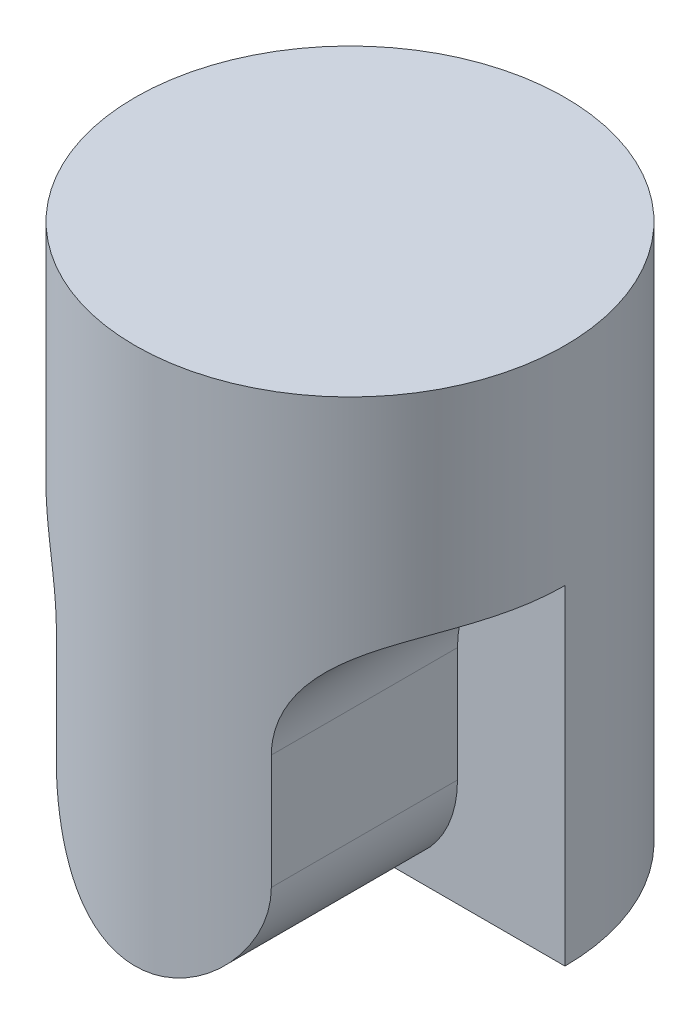
ISO-10303-21;
HEADER;
FILE_DESCRIPTION(('STEP AP214'),'2;1');
FILE_NAME('part.step','',(''),(''),'','','');
FILE_SCHEMA(('AUTOMOTIVE_DESIGN { 1 0 10303 214 1 1 1 1 }'));
ENDSEC;
DATA;
#1=APPLICATION_CONTEXT('core data for automotive mechanical design processes');
#2=APPLICATION_PROTOCOL_DEFINITION('international standard','automotive_design',2000,#1);
#3=PRODUCT_CONTEXT('',#1,'mechanical');
#4=PRODUCT('Part','Part','',(#3));
#5=PRODUCT_RELATED_PRODUCT_CATEGORY('part','',(#4));
#6=PRODUCT_DEFINITION_FORMATION('','',#4);
#7=PRODUCT_DEFINITION_CONTEXT('part definition',#1,'design');
#8=PRODUCT_DEFINITION('design','',#6,#7);
#9=PRODUCT_DEFINITION_SHAPE('','',#8);
#10=(LENGTH_UNIT() NAMED_UNIT(*) SI_UNIT(.MILLI.,.METRE.));
#11=(NAMED_UNIT(*) PLANE_ANGLE_UNIT() SI_UNIT($,.RADIAN.));
#12=(NAMED_UNIT(*) SI_UNIT($,.STERADIAN.) SOLID_ANGLE_UNIT());
#13=UNCERTAINTY_MEASURE_WITH_UNIT(LENGTH_MEASURE(1.E-05),#10,'distance_accuracy_value','');
#14=(GEOMETRIC_REPRESENTATION_CONTEXT(3) GLOBAL_UNCERTAINTY_ASSIGNED_CONTEXT((#13)) GLOBAL_UNIT_ASSIGNED_CONTEXT((#10,
#11,#12)) REPRESENTATION_CONTEXT('',''));
#15=CARTESIAN_POINT('',(0.,0.,0.));
#16=DIRECTION('',(0.,0.,1.));
#17=DIRECTION('',(1.,0.,0.));
#18=AXIS2_PLACEMENT_3D('',#15,#16,#17);
#19=CARTESIAN_POINT('',(0.,47.625,0.));
#20=DIRECTION('',(0.,-1.,0.));
#21=DIRECTION('',(0.,0.,-1.));
#22=AXIS2_PLACEMENT_3D('',#19,#20,#21);
#23=CYLINDRICAL_SURFACE('',#22,19.05);
#24=CARTESIAN_POINT('',(0.,47.625,0.));
#25=DIRECTION('',(0.,1.,0.));
#26=DIRECTION('',(0.,0.,1.));
#27=AXIS2_PLACEMENT_3D('',#24,#25,#26);
#28=CIRCLE('',#27,19.05);
#29=CARTESIAN_POINT('',(0.,47.625,19.05));
#30=VERTEX_POINT('',#29);
#31=EDGE_CURVE('E153',#30,#30,#28,.T.);
#32=ORIENTED_EDGE('',*,*,#31,.F.);
#33=EDGE_LOOP('',(#32));
#34=FACE_BOUND('',#33,.T.);
#35=DIRECTION('',(0.,-1.,0.));
#36=VECTOR('',#35,1.);
#37=CARTESIAN_POINT('',(-19.05,29.21,0.));
#38=LINE('',#37,#36);
#39=CARTESIAN_POINT('',(-19.05,29.21,0.));
#40=VERTEX_POINT('',#39);
#41=CARTESIAN_POINT('',(-19.05,0.,0.));
#42=VERTEX_POINT('',#41);
#43=EDGE_CURVE('E107',#40,#42,#38,.T.);
#44=ORIENTED_EDGE('',*,*,#43,.F.);
#45=CARTESIAN_POINT('',(-9.525,19.685,16.4977839420936));
#46=CARTESIAN_POINT('',(-9.52496088221768,19.9183489225181,16.4977688060201));
#47=CARTESIAN_POINT('',(-9.53357343537535,20.1516940752239,16.4928328837783));
#48=CARTESIAN_POINT('',(-9.56782098455367,20.6166928659615,16.4730090010301));
#49=CARTESIAN_POINT('',(-9.59345495367734,20.8483466051835,16.4581216408907));
#50=CARTESIAN_POINT('',(-9.66141827916372,21.3079945595453,16.4183115148276));
#51=CARTESIAN_POINT('',(-9.70372489570546,21.5359933207643,16.3934024165871));
#52=CARTESIAN_POINT('',(-9.80447603838081,21.9870185373,16.3333465257956));
#53=CARTESIAN_POINT('',(-9.86292032641455,22.2100450659259,16.2981998842917));
#54=CARTESIAN_POINT('',(-9.99521610639255,22.6496647273588,16.2174027920262));
#55=CARTESIAN_POINT('',(-10.0690759660033,22.8662542928987,16.1717466352449));
#56=CARTESIAN_POINT('',(-10.2311844392112,23.2913646090355,16.0696774570777));
#57=CARTESIAN_POINT('',(-10.3194332274116,23.4998852616819,16.0132643051592));
#58=CARTESIAN_POINT('',(-10.5090614848233,23.907378271473,15.889459842336));
#59=CARTESIAN_POINT('',(-10.610436090431,24.1063541280786,15.8220725953698));
#60=CARTESIAN_POINT('',(-10.8249112557721,24.4935890964673,15.6761159898764));
#61=CARTESIAN_POINT('',(-10.9380117932454,24.6818482285936,15.5975466525768));
#62=CARTESIAN_POINT('',(-11.1750045786399,25.0476332269237,15.428644017613));
#63=CARTESIAN_POINT('',(-11.2989547084654,25.225091737611,15.3382461680053));
#64=CARTESIAN_POINT('',(-11.5553100388477,25.5672572592252,15.146054428585));
#65=CARTESIAN_POINT('',(-11.6877152197723,25.7319642997583,15.0442605652328));
#66=CARTESIAN_POINT('',(-11.959148929316,26.0480866299765,14.8294036879515));
#67=CARTESIAN_POINT('',(-12.0981788316448,26.1994991442271,14.7163383313975));
#68=CARTESIAN_POINT('',(-12.3809673411905,26.4887154893166,14.4792332961164));
#69=CARTESIAN_POINT('',(-12.5247264570661,26.6265178498703,14.3551924344594));
#70=CARTESIAN_POINT('',(-12.8240837443095,26.8965667697806,14.08857600897));
#71=CARTESIAN_POINT('',(-12.9798652873072,27.0279466150489,13.9453291609657));
#72=CARTESIAN_POINT('',(-13.292596777246,27.2756345492098,13.6475637114415));
#73=CARTESIAN_POINT('',(-13.4495467455553,27.3919423617454,13.4930449033231));
#74=CARTESIAN_POINT('',(-13.762754527445,27.6100925803929,13.1734257935092));
#75=CARTESIAN_POINT('',(-13.9190122351257,27.7119328426242,13.0083239288083));
#76=CARTESIAN_POINT('',(-14.2291689687109,27.9019522424798,12.6683171080798));
#77=CARTESIAN_POINT('',(-14.3830675205959,27.9901286662581,12.4934102139944));
#78=CARTESIAN_POINT('',(-14.7634019767403,28.1948738825906,12.0444610740112));
#79=CARTESIAN_POINT('',(-14.9874622880082,28.3034702163249,11.7647359891822));
#80=CARTESIAN_POINT('',(-15.4231140025516,28.4956795942884,11.1875373147456));
#81=CARTESIAN_POINT('',(-15.6347002190687,28.5792823041117,10.8900564442661));
#82=CARTESIAN_POINT('',(-16.0430181059987,28.7255106526052,10.2790758596334));
#83=CARTESIAN_POINT('',(-16.2397117705415,28.7880839352012,9.96553837162547));
#84=CARTESIAN_POINT('',(-16.6156059306471,28.8957307298342,9.32534286156705));
#85=CARTESIAN_POINT('',(-16.7948065222032,28.9408043379049,8.99868491152914));
#86=CARTESIAN_POINT('',(-17.1919107043764,29.0299199555339,8.2213326110348));
#87=CARTESIAN_POINT('',(-17.4023168073958,29.068423234301,7.76615790744586));
#88=CARTESIAN_POINT('',(-17.7869232765458,29.1278875229511,6.83957324511065));
#89=CARTESIAN_POINT('',(-17.9611090507862,29.1488414730828,6.36815683196184));
#90=CARTESIAN_POINT('',(-18.2716936861273,29.1794304518547,5.41292995545997));
#91=CARTESIAN_POINT('',(-18.4081089023756,29.1890703854879,4.92912495598502));
#92=CARTESIAN_POINT('',(-18.6422412025836,29.201989918901,3.95240402807187));
#93=CARTESIAN_POINT('',(-18.7399742848313,29.2052721503127,3.45949195463885));
#94=CARTESIAN_POINT('',(-18.8953354589647,29.2090593684037,2.47291842915605));
#95=CARTESIAN_POINT('',(-18.9533953562265,29.209594684118,1.97932562121706));
#96=CARTESIAN_POINT('',(-19.0113808096327,29.2099382589662,1.23744501792454));
#97=CARTESIAN_POINT('',(-19.0258585637053,29.2099764580419,0.99021633027258));
#98=CARTESIAN_POINT('',(-19.0451690165321,29.2100015099948,0.495333730012836));
#99=CARTESIAN_POINT('',(-19.0499998133406,29.2099883527484,0.247679743186018));
#100=CARTESIAN_POINT('',(-19.05,29.21,0.));
#101=B_SPLINE_CURVE_WITH_KNOTS('',3,(#45,#46,#47,#48,#49,#50,#51,#52,#53,#54,#55,#56,#57,#58,
#59,#60,#61,#62,#63,#64,#65,#66,#67,#68,#69,#70,#71,#72,#73,#74,#75,#76,#77,#78,#79,#80,#81,#82,
#83,#84,#85,#86,#87,#88,#89,#90,#91,#92,#93,#94,#95,#96,#97,#98,#99,#100),.UNSPECIFIED.,.F.,.F.,
(4,2,2,2,2,2,2,2,2,2,2,2,2,2,2,2,2,2,2,2,2,2,2,2,2,2,2,4),(0.,0.699830412948111,
1.39961860917055,2.09845564936072,2.79728237925847,3.49648942772335,4.19570496138007,
4.89466214716575,5.59361800609943,6.29656113471492,6.99950263119766,7.70259053020982,
8.40575429989958,9.15228216119596,9.89882370870057,10.6454757676643,11.39227593352,
12.514027104908,13.6362414603873,14.7612293986247,15.886211163132,17.3928861920892,
18.90016703619,20.4067941835203,21.9127975621273,23.4021366350037,24.1449308829149,
24.8878715619513),.UNSPECIFIED.);
#102=CARTESIAN_POINT('',(-9.525,19.685,16.4977839420936));
#103=VERTEX_POINT('',#102);
#104=EDGE_CURVE('E11',#103,#40,#101,.T.);
#105=ORIENTED_EDGE('',*,*,#104,.F.);
#106=DIRECTION('',(0.,-1.,0.));
#107=VECTOR('',#106,1.);
#108=CARTESIAN_POINT('',(-9.525,47.625,16.4977839420936));
#109=LINE('',#108,#107);
#110=CARTESIAN_POINT('',(-9.525,9.525,16.4977839420936));
#111=VERTEX_POINT('',#110);
#112=EDGE_CURVE('E55',#111,#103,#109,.F.);
#113=ORIENTED_EDGE('',*,*,#112,.F.);
#114=CARTESIAN_POINT('',(9.525,9.525,16.4977839420936));
#115=CARTESIAN_POINT('',(9.52500093747722,9.40027257903626,16.4977810736085));
#116=CARTESIAN_POINT('',(9.5225495569074,9.27556275445861,16.4991989884944));
#117=CARTESIAN_POINT('',(9.51275833118321,9.02640408747146,16.5048470302731));
#118=CARTESIAN_POINT('',(9.50541869237711,8.90195523426799,16.5090770384588));
#119=CARTESIAN_POINT('',(9.47610793531884,8.52953393768727,16.5259318086842));
#120=CARTESIAN_POINT('',(9.4468449164186,8.28227418457605,16.5427214150306));
#121=CARTESIAN_POINT('',(9.36949132327823,7.79316834325038,16.5866536291743));
#122=CARTESIAN_POINT('',(9.32150961975951,7.55129934921615,16.6137363475916));
#123=CARTESIAN_POINT('',(9.20730560474538,7.07314911694342,16.6772985791049));
#124=CARTESIAN_POINT('',(9.14108119806888,6.83686852392151,16.7137791715191));
#125=CARTESIAN_POINT('',(8.99129510137312,6.37194751349169,16.7948306150653));
#126=CARTESIAN_POINT('',(8.90777526138408,6.14329017257846,16.8393819054122));
#127=CARTESIAN_POINT('',(8.72407711239021,5.69420111637847,16.9352799266333));
#128=CARTESIAN_POINT('',(8.62389244763594,5.47377257887555,16.9866292486582));
#129=CARTESIAN_POINT('',(8.29930376043627,4.82601405994061,17.1488381079658));
#130=CARTESIAN_POINT('',(8.05095104961338,4.41247529285722,17.2678097679841));
#131=CARTESIAN_POINT('',(7.47383610341883,3.59736922215471,17.5257462600222));
#132=CARTESIAN_POINT('',(7.14015861881285,3.19954734615327,17.6655504594134));
#133=CARTESIAN_POINT('',(6.5945742728477,2.64718480947574,17.8732248981855));
#134=CARTESIAN_POINT('',(6.405096610182,2.47038257450737,17.9421446448262));
#135=CARTESIAN_POINT('',(6.01181385771871,2.13237428291152,18.0777156327596));
#136=CARTESIAN_POINT('',(5.80800671051076,1.97117047381546,18.1443665462486));
#137=CARTESIAN_POINT('',(5.3727806496745,1.65505544151366,18.2781569518622));
#138=CARTESIAN_POINT('',(5.14042653030351,1.50131409278981,18.3450225150718));
#139=CARTESIAN_POINT('',(4.66194023067173,1.21417930587034,18.4724136519109));
#140=CARTESIAN_POINT('',(4.41581396469453,1.08077722351316,18.5329419154386));
#141=CARTESIAN_POINT('',(3.9113048509577,0.835583575964409,18.6459377391247));
#142=CARTESIAN_POINT('',(3.6529249193958,0.723786900816968,18.6984072046882));
#143=CARTESIAN_POINT('',(3.12571930630889,0.523053759715566,18.7937250695438));
#144=CARTESIAN_POINT('',(2.85689473869258,0.434114863667026,18.8365744915169));
#145=CARTESIAN_POINT('',(2.33040396449441,0.285723159455201,18.9086545346245));
#146=CARTESIAN_POINT('',(2.07330466066536,0.224622688619558,18.9386372001567));
#147=CARTESIAN_POINT('',(1.55394863629037,0.123892516824218,18.9883061715623));
#148=CARTESIAN_POINT('',(1.29169214034862,0.0842618829545443,19.0079929248136));
#149=CARTESIAN_POINT('',(0.764329359451927,0.0270138829097091,19.0364912437072));
#150=CARTESIAN_POINT('',(0.499224545496166,0.00938565748228554,19.0453081741061));
#151=CARTESIAN_POINT('',(-0.0316607049127102,-0.00364684179856453,19.0518227422365));
#152=CARTESIAN_POINT('',(-0.297441099043231,0.000947524886808438,19.0495210601461));
#153=CARTESIAN_POINT('',(-0.804260335281708,0.0309220556256001,19.0345541010599));
#154=CARTESIAN_POINT('',(-1.04543822592467,0.0544573009577164,19.0228087656957));
#155=CARTESIAN_POINT('',(-1.52469707257245,0.119714119923031,18.9904047862853));
#156=CARTESIAN_POINT('',(-1.76277824541268,0.161434413083271,18.9697467698133));
#157=CARTESIAN_POINT('',(-2.23423979863317,0.262606638129744,18.9200123581017));
#158=CARTESIAN_POINT('',(-2.46762011548931,0.322058809460912,18.8909358491819));
#159=CARTESIAN_POINT('',(-2.92820911012177,0.458088236319907,18.8250425547938));
#160=CARTESIAN_POINT('',(-3.15541756627715,0.534666105892989,18.7882254917892));
#161=CARTESIAN_POINT('',(-3.60539303848101,0.705394247452505,18.7071268740808));
#162=CARTESIAN_POINT('',(-3.82805781744348,0.799769061635013,18.662750728237));
#163=CARTESIAN_POINT('',(-4.26455258918911,1.00458926157806,18.5678772125521));
#164=CARTESIAN_POINT('',(-4.47837941582088,1.11504034359609,18.51737767409));
#165=CARTESIAN_POINT('',(-5.10493628361556,1.46924131553242,18.3583058720945));
#166=CARTESIAN_POINT('',(-5.50300713782787,1.73594015859678,18.2421108149243));
#167=CARTESIAN_POINT('',(-6.28824042603162,2.35173975094806,17.9874060959009));
#168=CARTESIAN_POINT('',(-6.67082158147181,2.70624414302929,17.8478253733575));
#169=CARTESIAN_POINT('',(-7.19758780100251,3.28095380587619,17.638966791211));
#170=CARTESIAN_POINT('',(-7.36544169669242,3.47985996295611,17.5693768805105));
#171=CARTESIAN_POINT('',(-7.68466910542571,3.89124176578629,17.4321111568734));
#172=CARTESIAN_POINT('',(-7.83604008320189,4.10371949105207,17.3644356395749));
#173=CARTESIAN_POINT('',(-8.13051871428544,4.55533319567051,17.2286143275175));
#174=CARTESIAN_POINT('',(-8.27246277842836,4.79530464840391,17.1607200036441));
#175=CARTESIAN_POINT('',(-8.53533313227252,5.28806294812108,17.0315012846856));
#176=CARTESIAN_POINT('',(-8.65626905076502,5.5408438550808,16.9701738847126));
#177=CARTESIAN_POINT('',(-8.87577538406711,6.05731622619944,16.856404687993));
#178=CARTESIAN_POINT('',(-8.97438588394681,6.32098711427254,16.8039470093352));
#179=CARTESIAN_POINT('',(-9.14827185774226,6.85774586401365,16.7099199172215));
#180=CARTESIAN_POINT('',(-9.22355744265247,7.13082958815204,16.6683457871286));
#181=CARTESIAN_POINT('',(-9.32597272818071,7.57995506914826,16.6111629660557));
#182=CARTESIAN_POINT('',(-9.36056268375989,7.75384156287729,16.5916705965462));
#183=CARTESIAN_POINT('',(-9.42003837397582,8.10374181043107,16.5579753127668));
#184=CARTESIAN_POINT('',(-9.44492679661978,8.27975496106751,16.5437709334007));
#185=CARTESIAN_POINT('',(-9.48486650450729,8.63355937576173,16.5209069824712));
#186=CARTESIAN_POINT('',(-9.49990078649616,8.81135317860914,16.5122569954949));
#187=CARTESIAN_POINT('',(-9.51997579030462,9.16776164551646,16.5006843298703));
#188=CARTESIAN_POINT('',(-9.52501242619609,9.34637661530021,16.4977639928726));
#189=CARTESIAN_POINT('',(-9.525,9.525,16.4977839420936));
#190=B_SPLINE_CURVE_WITH_KNOTS('',3,(#114,#115,#116,#117,#118,#119,#120,#121,#122,#123,#124,
#125,#126,#127,#128,#129,#130,#131,#132,#133,#134,#135,#136,#137,#138,#139,#140,#141,#142,#143,
#144,#145,#146,#147,#148,#149,#150,#151,#152,#153,#154,#155,#156,#157,#158,#159,#160,#161,#162,
#163,#164,#165,#166,#167,#168,#169,#170,#171,#172,#173,#174,#175,#176,#177,#178,#179,#180,#181,
#182,#183,#184,#185,#186,#187,#188,#189),.UNSPECIFIED.,.F.,.F.,(4,2,2,2,2,2,2,2,2,2,2,2,2,2,2,2,
2,2,2,2,2,2,2,2,2,2,2,2,2,2,2,2,2,2,2,2,2,4),(0.,0.374115362522842,0.748214933496801,
1.49577871567587,2.23905786353579,2.98242241289278,3.72400882015595,4.4658787101371,
5.95045512426883,7.55645263772861,8.36024673287263,9.16415647242587,10.0226343458625,
10.8807463441536,11.7386551389014,12.5964726884451,13.3932583086516,14.1900093040547,
14.9863669086265,15.7826757968484,16.5096401614227,17.2365533461549,17.9634763473071,
18.6904254166054,19.4272479176198,20.1643321332658,21.6376476059229,23.250115445615,
24.0576502518051,24.8653090914465,25.725087021335,26.5844698382329,27.4422971837309,
28.2997521522028,28.8345228002716,29.3691451737481,29.9046876229378,30.4404488974167),.UNSPECIFIED.);
#191=CARTESIAN_POINT('',(9.525,9.525,16.4977839420936));
#192=VERTEX_POINT('',#191);
#193=EDGE_CURVE('E155',#192,#111,#190,.T.);
#194=ORIENTED_EDGE('',*,*,#193,.F.);
#195=DIRECTION('',(0.,-1.,0.));
#196=VECTOR('',#195,1.);
#197=CARTESIAN_POINT('',(9.525,47.625,16.4977839420936));
#198=LINE('',#197,#196);
#199=CARTESIAN_POINT('',(9.525,19.685,16.4977839420936));
#200=VERTEX_POINT('',#199);
#201=EDGE_CURVE('E116',#200,#192,#198,.T.);
#202=ORIENTED_EDGE('',*,*,#201,.F.);
#203=CARTESIAN_POINT('',(19.05,29.21,0.));
#204=CARTESIAN_POINT('',(19.0500031423625,29.2099793158079,0.266319267713955));
#205=CARTESIAN_POINT('',(19.0444152804942,29.2099994611175,0.532636111404348));
#206=CARTESIAN_POINT('',(19.0220816882376,29.2099710782212,1.06480200302641));
#207=CARTESIAN_POINT('',(19.0053359391149,29.2099225499002,1.33065105017189));
#208=CARTESIAN_POINT('',(18.9607027480369,29.2096064298755,1.86151223113813));
#209=CARTESIAN_POINT('',(18.9328113312285,29.2093387599842,2.12652403235371));
#210=CARTESIAN_POINT('',(18.8659429637877,29.208279228249,2.65512565628479));
#211=CARTESIAN_POINT('',(18.826966044504,29.2074873678874,2.91871548301934));
#212=CARTESIAN_POINT('',(18.6929770588812,29.2037377959692,3.70973281370498));
#213=CARTESIAN_POINT('',(18.581158321484,29.1993996438799,4.23441175651461));
#214=CARTESIAN_POINT('',(18.3137533312449,29.1824456662411,5.27219090432969));
#215=CARTESIAN_POINT('',(18.1581791971509,29.169832131402,5.7852942729276));
#216=CARTESIAN_POINT('',(17.8379125076404,29.133662897117,6.70075992239466));
#217=CARTESIAN_POINT('',(17.6804671833627,29.1126181010311,7.10576455913998));
#218=CARTESIAN_POINT('',(17.3386312566981,29.0565985204871,7.90332416880696));
#219=CARTESIAN_POINT('',(17.1542402845231,29.0216235448469,8.29587897078353));
#220=CARTESIAN_POINT('',(16.7606596540479,28.9329786268124,9.06469601693218));
#221=CARTESIAN_POINT('',(16.5515475338079,28.8793661656446,9.4410044017695));
#222=CARTESIAN_POINT('',(16.1103899111492,28.7479604657312,10.1755152311398));
#223=CARTESIAN_POINT('',(15.878352893697,28.6701761507772,10.5337243009512));
#224=CARTESIAN_POINT('',(15.4635323640473,28.5109391646804,11.1298527951504));
#225=CARTESIAN_POINT('',(15.2854809081633,28.436804903698,11.3730378563674));
#226=CARTESIAN_POINT('',(14.9211876864376,28.2709521411411,11.8469357107622));
#227=CARTESIAN_POINT('',(14.7349480087414,28.1792381029144,12.0776516507182));
#228=CARTESIAN_POINT('',(14.3566570232797,27.9762115529755,12.5249603388487));
#229=CARTESIAN_POINT('',(14.1646108176963,27.8649158556334,12.7415649871816));
#230=CARTESIAN_POINT('',(13.7773658557318,27.6208237218171,13.1593218625055));
#231=CARTESIAN_POINT('',(13.5821676242865,27.4880308328915,13.3604766310327));
#232=CARTESIAN_POINT('',(13.2244587634061,27.2235414238597,13.7138070687217));
#233=CARTESIAN_POINT('',(13.0619119884757,27.0953370083323,13.8685640756173));
#234=CARTESIAN_POINT('',(12.7392042765104,26.8225136538933,14.1655651153781));
#235=CARTESIAN_POINT('',(12.5790428754823,26.6778979556844,14.3078116088559));
#236=CARTESIAN_POINT('',(12.2635021647983,26.3721016054898,14.5791743176606));
#237=CARTESIAN_POINT('',(12.1081222370277,26.2109231064135,14.7082922351707));
#238=CARTESIAN_POINT('',(11.8046225240808,25.872231057236,14.9529727074532));
#239=CARTESIAN_POINT('',(11.6565028356029,25.6947172896579,15.0685350817093));
#240=CARTESIAN_POINT('',(11.3693895159656,25.3231915201881,15.2863373805226));
#241=CARTESIAN_POINT('',(11.230439737627,25.1291091757352,15.3885153076288));
#242=CARTESIAN_POINT('',(10.964826940015,24.7262118944501,15.5788891221235));
#243=CARTESIAN_POINT('',(10.8381642817918,24.5173965250073,15.6670845986934));
#244=CARTESIAN_POINT('',(10.5993058379913,24.0863783263824,15.8296592787907));
#245=CARTESIAN_POINT('',(10.487117084096,23.8641690665461,15.9040317745394));
#246=CARTESIAN_POINT('',(10.2792478139679,23.4082099521896,16.0391692067522));
#247=CARTESIAN_POINT('',(10.1835654697823,23.174461379248,16.0999356502));
#248=CARTESIAN_POINT('',(10.0175858531755,22.7173607084186,16.2036796029616));
#249=CARTESIAN_POINT('',(9.94583426399626,22.4947757106972,16.24772025966));
#250=CARTESIAN_POINT('',(9.81855225442402,22.0431811636815,16.3249527281687));
#251=CARTESIAN_POINT('',(9.76302096730887,21.814171958378,16.3581451196608));
#252=CARTESIAN_POINT('',(9.66902743600899,21.3518895972506,16.4138779313956));
#253=CARTESIAN_POINT('',(9.63053204886234,21.1186256482057,16.4364390401545));
#254=CARTESIAN_POINT('',(9.57098044062086,20.649221275654,16.4711880105793));
#255=CARTESIAN_POINT('',(9.54991350563648,20.4130827100169,16.4833822452591));
#256=CARTESIAN_POINT('',(9.53345537960647,20.0945553962913,16.4928996548008));
#257=CARTESIAN_POINT('',(9.53028313867884,20.0126327665687,16.4947327063678));
#258=CARTESIAN_POINT('',(9.52605691472012,19.8488098651631,16.4971739342479));
#259=CARTESIAN_POINT('',(9.52500047597256,19.766909678003,16.4977835305723));
#260=CARTESIAN_POINT('',(9.525,19.685,16.4977839420936));
#261=B_SPLINE_CURVE_WITH_KNOTS('',3,(#203,#204,#205,#206,#207,#208,#209,#210,#211,#212,#213,
#214,#215,#216,#217,#218,#219,#220,#221,#222,#223,#224,#225,#226,#227,#228,#229,#230,#231,#232,
#233,#234,#235,#236,#237,#238,#239,#240,#241,#242,#243,#244,#245,#246,#247,#248,#249,#250,#251,
#252,#253,#254,#255,#256,#257,#258,#259,#260),.UNSPECIFIED.,.F.,.F.,(4,2,2,2,2,2,2,2,2,2,2,2,2,
2,2,2,2,2,2,2,2,2,2,2,2,2,2,2,4),(0.,0.798894479078058,1.5977902995246,2.39697128291902,
3.19615000633318,4.80349956064718,6.41040437178401,7.71439554079129,9.01840460678187,
10.3184270506312,11.6179701198004,12.5483662331231,13.4785264393491,14.4078917997747,
15.3371039488346,16.1117460161097,16.8862353816937,17.6606242026084,18.4350233347229,
19.2128914240023,19.9907823635955,20.7690498047639,21.5472310036427,22.2602861531013,
22.9733031939092,23.6849269115434,24.3961128430135,24.6420994894573,24.8878004644176),.UNSPECIFIED.);
#262=CARTESIAN_POINT('',(19.05,29.21,0.));
#263=VERTEX_POINT('',#262);
#264=EDGE_CURVE('E70',#263,#200,#261,.T.);
#265=ORIENTED_EDGE('',*,*,#264,.F.);
#266=DIRECTION('',(0.,1.,0.));
#267=VECTOR('',#266,1.);
#268=CARTESIAN_POINT('',(19.05,-1.366,0.));
#269=LINE('',#268,#267);
#270=CARTESIAN_POINT('',(19.05,0.,0.));
#271=VERTEX_POINT('',#270);
#272=EDGE_CURVE('E99',#271,#263,#269,.T.);
#273=ORIENTED_EDGE('',*,*,#272,.F.);
#274=CARTESIAN_POINT('',(0.,0.,0.));
#275=DIRECTION('',(0.,1.,0.));
#276=DIRECTION('',(0.,0.,1.));
#277=AXIS2_PLACEMENT_3D('',#274,#275,#276);
#278=CIRCLE('',#277,19.05);
#279=EDGE_CURVE('E150',#271,#42,#278,.T.);
#280=ORIENTED_EDGE('',*,*,#279,.T.);
#281=EDGE_LOOP('',(#44,#105,#113,#194,#202,#265,#273,#280));
#282=FACE_BOUND('',#281,.T.);
#283=ADVANCED_FACE('F39',(#34,#282),#23,.T.);
#284=CARTESIAN_POINT('',(0.,0.,0.));
#285=DIRECTION('',(0.,1.,0.));
#286=DIRECTION('',(0.,0.,1.));
#287=AXIS2_PLACEMENT_3D('',#284,#285,#286);
#288=PLANE('',#287);
#289=DIRECTION('',(1.,0.,0.));
#290=VECTOR('',#289,1.);
#291=CARTESIAN_POINT('',(0.,0.,0.));
#292=LINE('',#291,#290);
#293=CARTESIAN_POINT('',(0.,0.,0.));
#294=VERTEX_POINT('',#293);
#295=EDGE_CURVE('E117',#42,#294,#292,.T.);
#296=ORIENTED_EDGE('',*,*,#295,.F.);
#297=ORIENTED_EDGE('',*,*,#279,.F.);
#298=EDGE_CURVE('E103',#294,#271,#292,.T.);
#299=ORIENTED_EDGE('',*,*,#298,.F.);
#300=EDGE_LOOP('',(#296,#297,#299));
#301=FACE_BOUND('',#300,.T.);
#302=ADVANCED_FACE('F138',(#301),#288,.F.);
#303=CARTESIAN_POINT('',(0.,47.625,0.));
#304=DIRECTION('',(0.,1.,0.));
#305=DIRECTION('',(0.,0.,1.));
#306=AXIS2_PLACEMENT_3D('',#303,#304,#305);
#307=PLANE('',#306);
#308=ORIENTED_EDGE('',*,*,#31,.T.);
#309=EDGE_LOOP('',(#308));
#310=FACE_BOUND('',#309,.T.);
#311=ADVANCED_FACE('F134',(#310),#307,.T.);
#312=CARTESIAN_POINT('',(19.05,19.685,19.05));
#313=DIRECTION('',(0.,0.,-1.));
#314=DIRECTION('',(-1.,0.,0.));
#315=AXIS2_PLACEMENT_3D('',#312,#313,#314);
#316=CYLINDRICAL_SURFACE('',#315,9.525);
#317=ORIENTED_EDGE('',*,*,#264,.T.);
#318=DIRECTION('',(0.,0.,-1.));
#319=VECTOR('',#318,1.);
#320=CARTESIAN_POINT('',(9.525,19.685,19.05));
#321=LINE('',#320,#319);
#322=CARTESIAN_POINT('',(9.525,19.685,0.));
#323=VERTEX_POINT('',#322);
#324=EDGE_CURVE('E115',#200,#323,#321,.T.);
#325=ORIENTED_EDGE('',*,*,#324,.T.);
#326=CARTESIAN_POINT('',(19.05,19.685,0.));
#327=DIRECTION('',(0.,0.,1.));
#328=DIRECTION('',(1.,0.,0.));
#329=AXIS2_PLACEMENT_3D('',#326,#327,#328);
#330=CIRCLE('',#329,9.525);
#331=EDGE_CURVE('E105',#263,#323,#330,.T.);
#332=ORIENTED_EDGE('',*,*,#331,.F.);
#333=EDGE_LOOP('',(#317,#325,#332));
#334=FACE_BOUND('',#333,.T.);
#335=ADVANCED_FACE('F112',(#334),#316,.F.);
#336=CARTESIAN_POINT('',(9.525,19.685,19.05));
#337=DIRECTION('',(1.,0.,0.));
#338=DIRECTION('',(0.,0.,-1.));
#339=AXIS2_PLACEMENT_3D('',#336,#337,#338);
#340=PLANE('',#339);
#341=ORIENTED_EDGE('',*,*,#201,.T.);
#342=DIRECTION('',(0.,0.,-1.));
#343=VECTOR('',#342,1.);
#344=CARTESIAN_POINT('',(9.525,9.525,19.05));
#345=LINE('',#344,#343);
#346=CARTESIAN_POINT('',(9.525,9.525,0.));
#347=VERTEX_POINT('',#346);
#348=EDGE_CURVE('E236',#192,#347,#345,.T.);
#349=ORIENTED_EDGE('',*,*,#348,.T.);
#350=DIRECTION('',(0.,-1.,0.));
#351=VECTOR('',#350,1.);
#352=CARTESIAN_POINT('',(9.525,19.685,0.));
#353=LINE('',#352,#351);
#354=EDGE_CURVE('E111',#323,#347,#353,.T.);
#355=ORIENTED_EDGE('',*,*,#354,.F.);
#356=ORIENTED_EDGE('',*,*,#324,.F.);
#357=EDGE_LOOP('',(#341,#349,#355,#356));
#358=FACE_BOUND('',#357,.T.);
#359=ADVANCED_FACE('F132',(#358),#340,.T.);
#360=CARTESIAN_POINT('',(-9.525,9.525,19.05));
#361=DIRECTION('',(-1.,0.,0.));
#362=DIRECTION('',(0.,0.,1.));
#363=AXIS2_PLACEMENT_3D('',#360,#361,#362);
#364=PLANE('',#363);
#365=ORIENTED_EDGE('',*,*,#112,.T.);
#366=DIRECTION('',(0.,0.,-1.));
#367=VECTOR('',#366,1.);
#368=CARTESIAN_POINT('',(-9.525,19.685,19.05));
#369=LINE('',#368,#367);
#370=CARTESIAN_POINT('',(-9.525,19.685,0.));
#371=VERTEX_POINT('',#370);
#372=EDGE_CURVE('E244',#103,#371,#369,.T.);
#373=ORIENTED_EDGE('',*,*,#372,.T.);
#374=DIRECTION('',(0.,1.,0.));
#375=VECTOR('',#374,1.);
#376=CARTESIAN_POINT('',(-9.525,9.525,0.));
#377=LINE('',#376,#375);
#378=CARTESIAN_POINT('',(-9.525,9.525,0.));
#379=VERTEX_POINT('',#378);
#380=EDGE_CURVE('E255',#379,#371,#377,.T.);
#381=ORIENTED_EDGE('',*,*,#380,.F.);
#382=DIRECTION('',(0.,0.,-1.));
#383=VECTOR('',#382,1.);
#384=CARTESIAN_POINT('',(-9.525,9.525,19.05));
#385=LINE('',#384,#383);
#386=EDGE_CURVE('E243',#111,#379,#385,.T.);
#387=ORIENTED_EDGE('',*,*,#386,.F.);
#388=EDGE_LOOP('',(#365,#373,#381,#387));
#389=FACE_BOUND('',#388,.T.);
#390=ADVANCED_FACE('F170',(#389),#364,.T.);
#391=CARTESIAN_POINT('',(-19.05,19.685,19.05));
#392=DIRECTION('',(0.,0.,-1.));
#393=DIRECTION('',(-1.,0.,0.));
#394=AXIS2_PLACEMENT_3D('',#391,#392,#393);
#395=CYLINDRICAL_SURFACE('',#394,9.525);
#396=ORIENTED_EDGE('',*,*,#104,.T.);
#397=CARTESIAN_POINT('',(-19.05,19.685,0.));
#398=DIRECTION('',(0.,0.,1.));
#399=DIRECTION('',(1.,0.,0.));
#400=AXIS2_PLACEMENT_3D('',#397,#398,#399);
#401=CIRCLE('',#400,9.525);
#402=EDGE_CURVE('E249',#371,#40,#401,.T.);
#403=ORIENTED_EDGE('',*,*,#402,.F.);
#404=ORIENTED_EDGE('',*,*,#372,.F.);
#405=EDGE_LOOP('',(#396,#403,#404));
#406=FACE_BOUND('',#405,.T.);
#407=ADVANCED_FACE('F167',(#406),#395,.F.);
#408=CARTESIAN_POINT('',(0.,9.525,19.05));
#409=DIRECTION('',(0.,0.,-1.));
#410=DIRECTION('',(-1.,0.,0.));
#411=AXIS2_PLACEMENT_3D('',#408,#409,#410);
#412=CYLINDRICAL_SURFACE('',#411,9.525);
#413=ORIENTED_EDGE('',*,*,#193,.T.);
#414=ORIENTED_EDGE('',*,*,#386,.T.);
#415=CARTESIAN_POINT('',(0.,9.525,0.));
#416=DIRECTION('',(0.,0.,-1.));
#417=DIRECTION('',(1.,0.,0.));
#418=AXIS2_PLACEMENT_3D('',#415,#416,#417);
#419=CIRCLE('',#418,9.525);
#420=EDGE_CURVE('E257',#294,#379,#419,.T.);
#421=ORIENTED_EDGE('',*,*,#420,.F.);
#422=EDGE_CURVE('E56',#347,#294,#419,.T.);
#423=ORIENTED_EDGE('',*,*,#422,.F.);
#424=ORIENTED_EDGE('',*,*,#348,.F.);
#425=EDGE_LOOP('',(#413,#414,#421,#423,#424));
#426=FACE_BOUND('',#425,.T.);
#427=ADVANCED_FACE('F165',(#426),#412,.T.);
#428=CARTESIAN_POINT('',(19.05,19.685,0.));
#429=DIRECTION('',(0.,0.,1.));
#430=DIRECTION('',(1.,0.,0.));
#431=AXIS2_PLACEMENT_3D('',#428,#429,#430);
#432=PLANE('',#431);
#433=ORIENTED_EDGE('',*,*,#295,.T.);
#434=ORIENTED_EDGE('',*,*,#420,.T.);
#435=ORIENTED_EDGE('',*,*,#380,.T.);
#436=ORIENTED_EDGE('',*,*,#402,.T.);
#437=ORIENTED_EDGE('',*,*,#43,.T.);
#438=EDGE_LOOP('',(#433,#434,#435,#436,#437));
#439=FACE_BOUND('',#438,.T.);
#440=ADVANCED_FACE('F168',(#439),#432,.T.);
#441=ORIENTED_EDGE('',*,*,#298,.T.);
#442=ORIENTED_EDGE('',*,*,#272,.T.);
#443=ORIENTED_EDGE('',*,*,#331,.T.);
#444=ORIENTED_EDGE('',*,*,#354,.T.);
#445=ORIENTED_EDGE('',*,*,#422,.T.);
#446=EDGE_LOOP('',(#441,#442,#443,#444,#445));
#447=FACE_BOUND('',#446,.T.);
#448=ADVANCED_FACE('F102',(#447),#432,.T.);
#449=CLOSED_SHELL('',(#283,#302,#311,#335,#359,#390,#407,#427,#440,#448));
#450=MANIFOLD_SOLID_BREP('B2',#449);
#451=ADVANCED_BREP_SHAPE_REPRESENTATION('',(#18,#450),#14);
#452=SHAPE_DEFINITION_REPRESENTATION(#9,#451);
ENDSEC;
END-ISO-10303-21;
